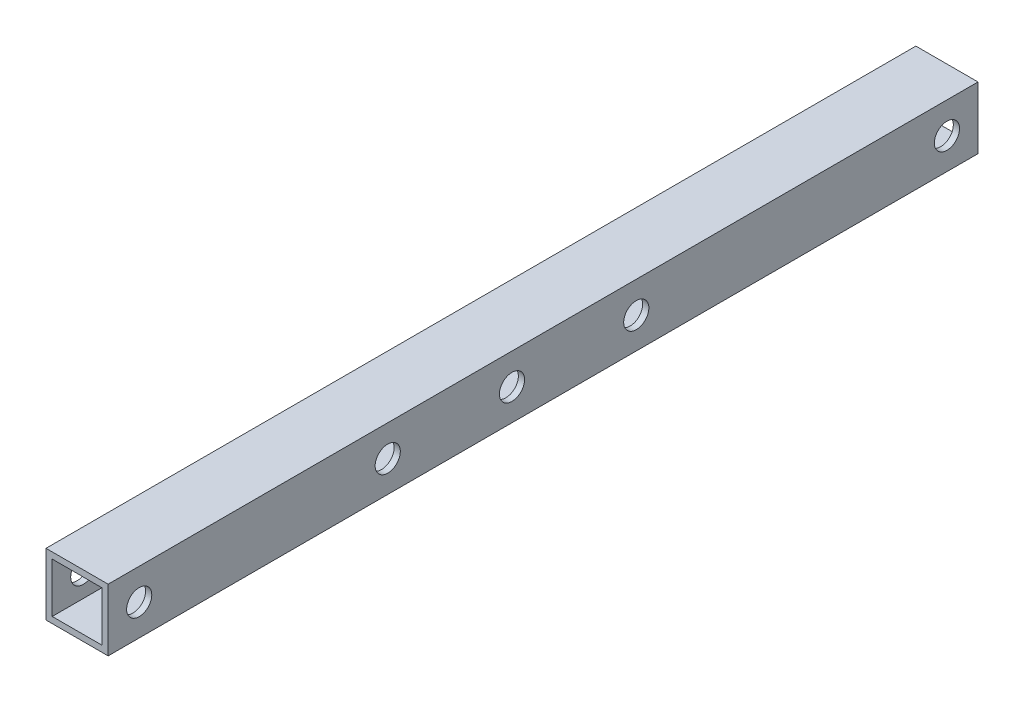
ISO-10303-21;
HEADER;
FILE_DESCRIPTION(('STEP AP214'),'2;1');
FILE_NAME('part.step','',(''),(''),'','','');
FILE_SCHEMA(('AUTOMOTIVE_DESIGN { 1 0 10303 214 1 1 1 1 }'));
ENDSEC;
DATA;
#1=APPLICATION_CONTEXT('core data for automotive mechanical design processes');
#2=APPLICATION_PROTOCOL_DEFINITION('international standard','automotive_design',2000,#1);
#3=PRODUCT_CONTEXT('',#1,'mechanical');
#4=PRODUCT('Part','Part','',(#3));
#5=PRODUCT_RELATED_PRODUCT_CATEGORY('part','',(#4));
#6=PRODUCT_DEFINITION_FORMATION('','',#4);
#7=PRODUCT_DEFINITION_CONTEXT('part definition',#1,'design');
#8=PRODUCT_DEFINITION('design','',#6,#7);
#9=PRODUCT_DEFINITION_SHAPE('','',#8);
#10=(LENGTH_UNIT() NAMED_UNIT(*) SI_UNIT(.MILLI.,.METRE.));
#11=(NAMED_UNIT(*) PLANE_ANGLE_UNIT() SI_UNIT($,.RADIAN.));
#12=(NAMED_UNIT(*) SI_UNIT($,.STERADIAN.) SOLID_ANGLE_UNIT());
#13=UNCERTAINTY_MEASURE_WITH_UNIT(LENGTH_MEASURE(1.E-05),#10,'distance_accuracy_value','');
#14=(GEOMETRIC_REPRESENTATION_CONTEXT(3) GLOBAL_UNCERTAINTY_ASSIGNED_CONTEXT((#13)) GLOBAL_UNIT_ASSIGNED_CONTEXT((#10,
#11,#12)) REPRESENTATION_CONTEXT('',''));
#15=CARTESIAN_POINT('',(0.,0.,0.));
#16=DIRECTION('',(0.,0.,1.));
#17=DIRECTION('',(1.,0.,0.));
#18=AXIS2_PLACEMENT_3D('',#15,#16,#17);
#19=CARTESIAN_POINT('',(0.,0.,140.));
#20=DIRECTION('',(0.,0.,1.));
#21=DIRECTION('',(1.,0.,0.));
#22=AXIS2_PLACEMENT_3D('',#19,#20,#21);
#23=PLANE('',#22);
#24=DIRECTION('',(0.,1.,0.));
#25=VECTOR('',#24,1.);
#26=CARTESIAN_POINT('',(4.99999999999999,5.,140.));
#27=LINE('',#26,#25);
#28=CARTESIAN_POINT('',(4.99999999999999,-5.00000000000001,140.));
#29=VERTEX_POINT('',#28);
#30=CARTESIAN_POINT('',(4.99999999999999,5.,140.));
#31=VERTEX_POINT('',#30);
#32=EDGE_CURVE('E157',#29,#31,#27,.T.);
#33=ORIENTED_EDGE('',*,*,#32,.T.);
#34=DIRECTION('',(-1.,0.,0.));
#35=VECTOR('',#34,1.);
#36=CARTESIAN_POINT('',(-5.00000000000001,5.,140.));
#37=LINE('',#36,#35);
#38=CARTESIAN_POINT('',(-5.00000000000001,5.,140.));
#39=VERTEX_POINT('',#38);
#40=EDGE_CURVE('E161',#31,#39,#37,.T.);
#41=ORIENTED_EDGE('',*,*,#40,.T.);
#42=DIRECTION('',(0.,-1.,0.));
#43=VECTOR('',#42,1.);
#44=CARTESIAN_POINT('',(-5.00000000000001,5.,140.));
#45=LINE('',#44,#43);
#46=CARTESIAN_POINT('',(-5.00000000000001,-5.00000000000001,140.));
#47=VERTEX_POINT('',#46);
#48=EDGE_CURVE('E165',#39,#47,#45,.T.);
#49=ORIENTED_EDGE('',*,*,#48,.T.);
#50=DIRECTION('',(1.,0.,0.));
#51=VECTOR('',#50,1.);
#52=CARTESIAN_POINT('',(-5.00000000000001,-5.00000000000001,140.));
#53=LINE('',#52,#51);
#54=EDGE_CURVE('E168',#47,#29,#53,.T.);
#55=ORIENTED_EDGE('',*,*,#54,.T.);
#56=EDGE_LOOP('',(#33,#41,#49,#55));
#57=FACE_BOUND('',#56,.T.);
#58=DIRECTION('',(-1.,0.,0.));
#59=VECTOR('',#58,1.);
#60=CARTESIAN_POINT('',(-4.00000000000001,4.,140.));
#61=LINE('',#60,#59);
#62=CARTESIAN_POINT('',(3.99999999999999,4.,140.));
#63=VERTEX_POINT('',#62);
#64=CARTESIAN_POINT('',(-4.00000000000001,4.,140.));
#65=VERTEX_POINT('',#64);
#66=EDGE_CURVE('E116',#63,#65,#61,.T.);
#67=ORIENTED_EDGE('',*,*,#66,.F.);
#68=DIRECTION('',(0.,1.,0.));
#69=VECTOR('',#68,1.);
#70=CARTESIAN_POINT('',(3.99999999999999,4.,140.));
#71=LINE('',#70,#69);
#72=CARTESIAN_POINT('',(3.99999999999999,-4.,140.));
#73=VERTEX_POINT('',#72);
#74=EDGE_CURVE('E107',#73,#63,#71,.T.);
#75=ORIENTED_EDGE('',*,*,#74,.F.);
#76=DIRECTION('',(1.,0.,0.));
#77=VECTOR('',#76,1.);
#78=CARTESIAN_POINT('',(-4.00000000000001,-4.,140.));
#79=LINE('',#78,#77);
#80=CARTESIAN_POINT('',(-4.00000000000001,-4.,140.));
#81=VERTEX_POINT('',#80);
#82=EDGE_CURVE('E133',#81,#73,#79,.T.);
#83=ORIENTED_EDGE('',*,*,#82,.F.);
#84=DIRECTION('',(0.,-1.,0.));
#85=VECTOR('',#84,1.);
#86=CARTESIAN_POINT('',(-4.00000000000001,4.,140.));
#87=LINE('',#86,#85);
#88=EDGE_CURVE('E129',#65,#81,#87,.T.);
#89=ORIENTED_EDGE('',*,*,#88,.F.);
#90=EDGE_LOOP('',(#67,#75,#83,#89));
#91=FACE_BOUND('',#90,.T.);
#92=ADVANCED_FACE('F39',(#57,#91),#23,.T.);
#93=CARTESIAN_POINT('',(0.,0.,0.));
#94=DIRECTION('',(0.,0.,1.));
#95=DIRECTION('',(1.,0.,0.));
#96=AXIS2_PLACEMENT_3D('',#93,#94,#95);
#97=PLANE('',#96);
#98=DIRECTION('',(0.,1.,0.));
#99=VECTOR('',#98,1.);
#100=CARTESIAN_POINT('',(4.99999999999999,5.,0.));
#101=LINE('',#100,#99);
#102=CARTESIAN_POINT('',(4.99999999999999,-5.00000000000001,0.));
#103=VERTEX_POINT('',#102);
#104=CARTESIAN_POINT('',(4.99999999999999,5.,0.));
#105=VERTEX_POINT('',#104);
#106=EDGE_CURVE('E125',#103,#105,#101,.T.);
#107=ORIENTED_EDGE('',*,*,#106,.F.);
#108=DIRECTION('',(1.,0.,0.));
#109=VECTOR('',#108,1.);
#110=CARTESIAN_POINT('',(-5.00000000000001,-5.00000000000001,0.));
#111=LINE('',#110,#109);
#112=CARTESIAN_POINT('',(-5.00000000000001,-5.00000000000001,0.));
#113=VERTEX_POINT('',#112);
#114=EDGE_CURVE('E162',#113,#103,#111,.T.);
#115=ORIENTED_EDGE('',*,*,#114,.F.);
#116=DIRECTION('',(0.,-1.,0.));
#117=VECTOR('',#116,1.);
#118=CARTESIAN_POINT('',(-5.00000000000001,5.,0.));
#119=LINE('',#118,#117);
#120=CARTESIAN_POINT('',(-5.00000000000001,5.,0.));
#121=VERTEX_POINT('',#120);
#122=EDGE_CURVE('E178',#121,#113,#119,.T.);
#123=ORIENTED_EDGE('',*,*,#122,.F.);
#124=DIRECTION('',(-1.,0.,0.));
#125=VECTOR('',#124,1.);
#126=CARTESIAN_POINT('',(-5.00000000000001,5.,0.));
#127=LINE('',#126,#125);
#128=EDGE_CURVE('E175',#105,#121,#127,.T.);
#129=ORIENTED_EDGE('',*,*,#128,.F.);
#130=EDGE_LOOP('',(#107,#115,#123,#129));
#131=FACE_BOUND('',#130,.T.);
#132=DIRECTION('',(0.,1.,0.));
#133=VECTOR('',#132,1.);
#134=CARTESIAN_POINT('',(3.99999999999999,4.,0.));
#135=LINE('',#134,#133);
#136=CARTESIAN_POINT('',(3.99999999999999,-4.,0.));
#137=VERTEX_POINT('',#136);
#138=CARTESIAN_POINT('',(3.99999999999999,4.,0.));
#139=VERTEX_POINT('',#138);
#140=EDGE_CURVE('E65',#137,#139,#135,.T.);
#141=ORIENTED_EDGE('',*,*,#140,.T.);
#142=DIRECTION('',(-1.,0.,0.));
#143=VECTOR('',#142,1.);
#144=CARTESIAN_POINT('',(-4.00000000000001,4.,0.));
#145=LINE('',#144,#143);
#146=CARTESIAN_POINT('',(-4.00000000000001,4.,0.));
#147=VERTEX_POINT('',#146);
#148=EDGE_CURVE('E123',#139,#147,#145,.T.);
#149=ORIENTED_EDGE('',*,*,#148,.T.);
#150=DIRECTION('',(0.,-1.,0.));
#151=VECTOR('',#150,1.);
#152=CARTESIAN_POINT('',(-4.00000000000001,4.,0.));
#153=LINE('',#152,#151);
#154=CARTESIAN_POINT('',(-4.00000000000001,-4.,0.));
#155=VERTEX_POINT('',#154);
#156=EDGE_CURVE('E144',#147,#155,#153,.T.);
#157=ORIENTED_EDGE('',*,*,#156,.T.);
#158=DIRECTION('',(1.,0.,0.));
#159=VECTOR('',#158,1.);
#160=CARTESIAN_POINT('',(-4.00000000000001,-4.,0.));
#161=LINE('',#160,#159);
#162=EDGE_CURVE('E117',#155,#137,#161,.T.);
#163=ORIENTED_EDGE('',*,*,#162,.T.);
#164=EDGE_LOOP('',(#141,#149,#157,#163));
#165=FACE_BOUND('',#164,.T.);
#166=ADVANCED_FACE('F291',(#131,#165),#97,.F.);
#167=CARTESIAN_POINT('',(4.99999999999999,5.,140.));
#168=DIRECTION('',(-1.,0.,0.));
#169=DIRECTION('',(0.,-1.,0.));
#170=AXIS2_PLACEMENT_3D('',#167,#168,#169);
#171=PLANE('',#170);
#172=CARTESIAN_POINT('',(4.99999999999999,0.,135.));
#173=DIRECTION('',(1.,0.,0.));
#174=DIRECTION('',(0.,1.,0.));
#175=AXIS2_PLACEMENT_3D('',#172,#173,#174);
#176=CIRCLE('',#175,2.02500000000001);
#177=CARTESIAN_POINT('',(4.99999999999999,2.02500000000001,135.));
#178=VERTEX_POINT('',#177);
#179=EDGE_CURVE('E220',#178,#178,#176,.T.);
#180=ORIENTED_EDGE('',*,*,#179,.F.);
#181=EDGE_LOOP('',(#180));
#182=FACE_BOUND('',#181,.T.);
#183=CARTESIAN_POINT('',(4.99999999999999,0.,95.));
#184=DIRECTION('',(1.,0.,0.));
#185=DIRECTION('',(0.,1.,0.));
#186=AXIS2_PLACEMENT_3D('',#183,#184,#185);
#187=CIRCLE('',#186,2.02499999999999);
#188=CARTESIAN_POINT('',(4.99999999999999,2.025,95.));
#189=VERTEX_POINT('',#188);
#190=EDGE_CURVE('E232',#189,#189,#187,.T.);
#191=ORIENTED_EDGE('',*,*,#190,.F.);
#192=EDGE_LOOP('',(#191));
#193=FACE_BOUND('',#192,.T.);
#194=CARTESIAN_POINT('',(4.99999999999999,0.,75.));
#195=DIRECTION('',(1.,0.,0.));
#196=DIRECTION('',(0.,1.,0.));
#197=AXIS2_PLACEMENT_3D('',#194,#195,#196);
#198=CIRCLE('',#197,2.02499999999999);
#199=CARTESIAN_POINT('',(4.99999999999999,2.025,75.));
#200=VERTEX_POINT('',#199);
#201=EDGE_CURVE('E244',#200,#200,#198,.T.);
#202=ORIENTED_EDGE('',*,*,#201,.F.);
#203=EDGE_LOOP('',(#202));
#204=FACE_BOUND('',#203,.T.);
#205=CARTESIAN_POINT('',(4.99999999999999,0.,55.));
#206=DIRECTION('',(1.,0.,0.));
#207=DIRECTION('',(0.,1.,0.));
#208=AXIS2_PLACEMENT_3D('',#205,#206,#207);
#209=CIRCLE('',#208,2.025);
#210=CARTESIAN_POINT('',(4.99999999999999,2.025,55.));
#211=VERTEX_POINT('',#210);
#212=EDGE_CURVE('E240',#211,#211,#209,.T.);
#213=ORIENTED_EDGE('',*,*,#212,.F.);
#214=EDGE_LOOP('',(#213));
#215=FACE_BOUND('',#214,.T.);
#216=CARTESIAN_POINT('',(4.99999999999999,0.,5.));
#217=DIRECTION('',(1.,0.,0.));
#218=DIRECTION('',(0.,1.,0.));
#219=AXIS2_PLACEMENT_3D('',#216,#217,#218);
#220=CIRCLE('',#219,2.025);
#221=CARTESIAN_POINT('',(4.99999999999999,2.025,5.));
#222=VERTEX_POINT('',#221);
#223=EDGE_CURVE('E261',#222,#222,#220,.T.);
#224=ORIENTED_EDGE('',*,*,#223,.F.);
#225=EDGE_LOOP('',(#224));
#226=FACE_BOUND('',#225,.T.);
#227=ORIENTED_EDGE('',*,*,#106,.T.);
#228=DIRECTION('',(0.,0.,-1.));
#229=VECTOR('',#228,1.);
#230=CARTESIAN_POINT('',(4.99999999999999,5.,140.));
#231=LINE('',#230,#229);
#232=EDGE_CURVE('E11',#31,#105,#231,.T.);
#233=ORIENTED_EDGE('',*,*,#232,.F.);
#234=ORIENTED_EDGE('',*,*,#32,.F.);
#235=DIRECTION('',(0.,0.,-1.));
#236=VECTOR('',#235,1.);
#237=CARTESIAN_POINT('',(4.99999999999999,-5.00000000000001,140.));
#238=LINE('',#237,#236);
#239=EDGE_CURVE('E171',#29,#103,#238,.T.);
#240=ORIENTED_EDGE('',*,*,#239,.T.);
#241=EDGE_LOOP('',(#227,#233,#234,#240));
#242=FACE_BOUND('',#241,.T.);
#243=ADVANCED_FACE('F41',(#182,#193,#204,#215,#226,#242),#171,.F.);
#244=CARTESIAN_POINT('',(-5.00000000000001,5.,140.));
#245=DIRECTION('',(0.,-1.,0.));
#246=DIRECTION('',(0.,0.,-1.));
#247=AXIS2_PLACEMENT_3D('',#244,#245,#246);
#248=PLANE('',#247);
#249=ORIENTED_EDGE('',*,*,#128,.T.);
#250=DIRECTION('',(0.,0.,-1.));
#251=VECTOR('',#250,1.);
#252=CARTESIAN_POINT('',(-5.00000000000001,5.,140.));
#253=LINE('',#252,#251);
#254=EDGE_CURVE('E49',#39,#121,#253,.T.);
#255=ORIENTED_EDGE('',*,*,#254,.F.);
#256=ORIENTED_EDGE('',*,*,#40,.F.);
#257=ORIENTED_EDGE('',*,*,#232,.T.);
#258=EDGE_LOOP('',(#249,#255,#256,#257));
#259=FACE_BOUND('',#258,.T.);
#260=ADVANCED_FACE('F300',(#259),#248,.F.);
#261=CARTESIAN_POINT('',(-5.00000000000001,5.,140.));
#262=DIRECTION('',(1.,0.,0.));
#263=DIRECTION('',(0.,1.,0.));
#264=AXIS2_PLACEMENT_3D('',#261,#262,#263);
#265=PLANE('',#264);
#266=CARTESIAN_POINT('',(-5.00000000000002,0.,135.));
#267=DIRECTION('',(1.,0.,0.));
#268=DIRECTION('',(0.,1.,0.));
#269=AXIS2_PLACEMENT_3D('',#266,#267,#268);
#270=CIRCLE('',#269,2.02500000000001);
#271=CARTESIAN_POINT('',(-5.00000000000002,2.02500000000001,135.));
#272=VERTEX_POINT('',#271);
#273=EDGE_CURVE('E212',#272,#272,#270,.T.);
#274=ORIENTED_EDGE('',*,*,#273,.T.);
#275=EDGE_LOOP('',(#274));
#276=FACE_BOUND('',#275,.T.);
#277=CARTESIAN_POINT('',(-5.00000000000002,0.,95.));
#278=DIRECTION('',(1.,0.,0.));
#279=DIRECTION('',(0.,1.,0.));
#280=AXIS2_PLACEMENT_3D('',#277,#278,#279);
#281=CIRCLE('',#280,2.02499999999999);
#282=CARTESIAN_POINT('',(-5.00000000000002,2.02499999999999,95.));
#283=VERTEX_POINT('',#282);
#284=EDGE_CURVE('E226',#283,#283,#281,.T.);
#285=ORIENTED_EDGE('',*,*,#284,.T.);
#286=EDGE_LOOP('',(#285));
#287=FACE_BOUND('',#286,.T.);
#288=CARTESIAN_POINT('',(-5.00000000000001,0.,75.));
#289=DIRECTION('',(1.,0.,0.));
#290=DIRECTION('',(0.,1.,0.));
#291=AXIS2_PLACEMENT_3D('',#288,#289,#290);
#292=CIRCLE('',#291,2.02499999999999);
#293=CARTESIAN_POINT('',(-5.00000000000001,2.02499999999999,75.));
#294=VERTEX_POINT('',#293);
#295=EDGE_CURVE('E203',#294,#294,#292,.T.);
#296=ORIENTED_EDGE('',*,*,#295,.T.);
#297=EDGE_LOOP('',(#296));
#298=FACE_BOUND('',#297,.T.);
#299=CARTESIAN_POINT('',(-5.00000000000001,0.,55.));
#300=DIRECTION('',(1.,0.,0.));
#301=DIRECTION('',(0.,1.,0.));
#302=AXIS2_PLACEMENT_3D('',#299,#300,#301);
#303=CIRCLE('',#302,2.025);
#304=CARTESIAN_POINT('',(-5.00000000000001,2.025,55.));
#305=VERTEX_POINT('',#304);
#306=EDGE_CURVE('E248',#305,#305,#303,.T.);
#307=ORIENTED_EDGE('',*,*,#306,.T.);
#308=EDGE_LOOP('',(#307));
#309=FACE_BOUND('',#308,.T.);
#310=CARTESIAN_POINT('',(-5.00000000000001,0.,5.));
#311=DIRECTION('',(1.,0.,0.));
#312=DIRECTION('',(0.,1.,0.));
#313=AXIS2_PLACEMENT_3D('',#310,#311,#312);
#314=CIRCLE('',#313,2.025);
#315=CARTESIAN_POINT('',(-5.00000000000001,2.025,5.));
#316=VERTEX_POINT('',#315);
#317=EDGE_CURVE('E197',#316,#316,#314,.T.);
#318=ORIENTED_EDGE('',*,*,#317,.T.);
#319=EDGE_LOOP('',(#318));
#320=FACE_BOUND('',#319,.T.);
#321=ORIENTED_EDGE('',*,*,#122,.T.);
#322=DIRECTION('',(0.,0.,-1.));
#323=VECTOR('',#322,1.);
#324=CARTESIAN_POINT('',(-5.00000000000001,-5.00000000000001,140.));
#325=LINE('',#324,#323);
#326=EDGE_CURVE('E186',#47,#113,#325,.T.);
#327=ORIENTED_EDGE('',*,*,#326,.F.);
#328=ORIENTED_EDGE('',*,*,#48,.F.);
#329=ORIENTED_EDGE('',*,*,#254,.T.);
#330=EDGE_LOOP('',(#321,#327,#328,#329));
#331=FACE_BOUND('',#330,.T.);
#332=ADVANCED_FACE('F284',(#276,#287,#298,#309,#320,#331),#265,.F.);
#333=CARTESIAN_POINT('',(-5.00000000000001,-5.00000000000001,140.));
#334=DIRECTION('',(0.,1.,0.));
#335=DIRECTION('',(0.,0.,1.));
#336=AXIS2_PLACEMENT_3D('',#333,#334,#335);
#337=PLANE('',#336);
#338=ORIENTED_EDGE('',*,*,#114,.T.);
#339=ORIENTED_EDGE('',*,*,#239,.F.);
#340=ORIENTED_EDGE('',*,*,#54,.F.);
#341=ORIENTED_EDGE('',*,*,#326,.T.);
#342=EDGE_LOOP('',(#338,#339,#340,#341));
#343=FACE_BOUND('',#342,.T.);
#344=ADVANCED_FACE('F275',(#343),#337,.F.);
#345=CARTESIAN_POINT('',(3.99999999999999,4.,140.));
#346=DIRECTION('',(-1.,0.,0.));
#347=DIRECTION('',(0.,0.,1.));
#348=AXIS2_PLACEMENT_3D('',#345,#346,#347);
#349=PLANE('',#348);
#350=CARTESIAN_POINT('',(3.99999999999999,0.,135.));
#351=DIRECTION('',(-1.,0.,0.));
#352=DIRECTION('',(0.,0.,1.));
#353=AXIS2_PLACEMENT_3D('',#350,#351,#352);
#354=CIRCLE('',#353,2.02500000000001);
#355=CARTESIAN_POINT('',(3.99999999999999,0.,137.025));
#356=VERTEX_POINT('',#355);
#357=EDGE_CURVE('E236',#356,#356,#354,.T.);
#358=ORIENTED_EDGE('',*,*,#357,.F.);
#359=EDGE_LOOP('',(#358));
#360=FACE_BOUND('',#359,.T.);
#361=CARTESIAN_POINT('',(3.99999999999999,0.,95.));
#362=DIRECTION('',(-1.,0.,0.));
#363=DIRECTION('',(0.,0.,1.));
#364=AXIS2_PLACEMENT_3D('',#361,#362,#363);
#365=CIRCLE('',#364,2.02499999999999);
#366=CARTESIAN_POINT('',(3.99999999999999,0.,97.025));
#367=VERTEX_POINT('',#366);
#368=EDGE_CURVE('E211',#367,#367,#365,.T.);
#369=ORIENTED_EDGE('',*,*,#368,.F.);
#370=EDGE_LOOP('',(#369));
#371=FACE_BOUND('',#370,.T.);
#372=CARTESIAN_POINT('',(3.99999999999999,0.,75.));
#373=DIRECTION('',(-1.,0.,0.));
#374=DIRECTION('',(0.,0.,1.));
#375=AXIS2_PLACEMENT_3D('',#372,#373,#374);
#376=CIRCLE('',#375,2.02499999999999);
#377=CARTESIAN_POINT('',(3.99999999999999,0.,77.025));
#378=VERTEX_POINT('',#377);
#379=EDGE_CURVE('E207',#378,#378,#376,.T.);
#380=ORIENTED_EDGE('',*,*,#379,.F.);
#381=EDGE_LOOP('',(#380));
#382=FACE_BOUND('',#381,.T.);
#383=CARTESIAN_POINT('',(3.99999999999999,0.,55.));
#384=DIRECTION('',(-1.,0.,0.));
#385=DIRECTION('',(0.,0.,1.));
#386=AXIS2_PLACEMENT_3D('',#383,#384,#385);
#387=CIRCLE('',#386,2.025);
#388=CARTESIAN_POINT('',(3.99999999999999,0.,57.025));
#389=VERTEX_POINT('',#388);
#390=EDGE_CURVE('E202',#389,#389,#387,.T.);
#391=ORIENTED_EDGE('',*,*,#390,.F.);
#392=EDGE_LOOP('',(#391));
#393=FACE_BOUND('',#392,.T.);
#394=CARTESIAN_POINT('',(3.99999999999999,0.,5.));
#395=DIRECTION('',(-1.,0.,0.));
#396=DIRECTION('',(0.,0.,1.));
#397=AXIS2_PLACEMENT_3D('',#394,#395,#396);
#398=CIRCLE('',#397,2.025);
#399=CARTESIAN_POINT('',(3.99999999999999,2.025,5.));
#400=VERTEX_POINT('',#399);
#401=EDGE_CURVE('E141',#400,#400,#398,.T.);
#402=ORIENTED_EDGE('',*,*,#401,.F.);
#403=EDGE_LOOP('',(#402));
#404=FACE_BOUND('',#403,.T.);
#405=ORIENTED_EDGE('',*,*,#140,.F.);
#406=DIRECTION('',(0.,0.,-1.));
#407=VECTOR('',#406,1.);
#408=CARTESIAN_POINT('',(3.99999999999999,-4.,140.));
#409=LINE('',#408,#407);
#410=EDGE_CURVE('E111',#73,#137,#409,.T.);
#411=ORIENTED_EDGE('',*,*,#410,.F.);
#412=ORIENTED_EDGE('',*,*,#74,.T.);
#413=DIRECTION('',(0.,0.,-1.));
#414=VECTOR('',#413,1.);
#415=CARTESIAN_POINT('',(3.99999999999999,4.,140.));
#416=LINE('',#415,#414);
#417=EDGE_CURVE('E110',#63,#139,#416,.T.);
#418=ORIENTED_EDGE('',*,*,#417,.T.);
#419=EDGE_LOOP('',(#405,#411,#412,#418));
#420=FACE_BOUND('',#419,.T.);
#421=ADVANCED_FACE('F109',(#360,#371,#382,#393,#404,#420),#349,.T.);
#422=CARTESIAN_POINT('',(-4.00000000000001,4.,140.));
#423=DIRECTION('',(0.,-1.,0.));
#424=DIRECTION('',(0.,0.,-1.));
#425=AXIS2_PLACEMENT_3D('',#422,#423,#424);
#426=PLANE('',#425);
#427=ORIENTED_EDGE('',*,*,#148,.F.);
#428=ORIENTED_EDGE('',*,*,#417,.F.);
#429=ORIENTED_EDGE('',*,*,#66,.T.);
#430=DIRECTION('',(0.,0.,-1.));
#431=VECTOR('',#430,1.);
#432=CARTESIAN_POINT('',(-4.00000000000001,4.,140.));
#433=LINE('',#432,#431);
#434=EDGE_CURVE('E126',#65,#147,#433,.T.);
#435=ORIENTED_EDGE('',*,*,#434,.T.);
#436=EDGE_LOOP('',(#427,#428,#429,#435));
#437=FACE_BOUND('',#436,.T.);
#438=ADVANCED_FACE('F120',(#437),#426,.T.);
#439=CARTESIAN_POINT('',(-4.00000000000001,4.,140.));
#440=DIRECTION('',(1.,0.,0.));
#441=DIRECTION('',(0.,1.,0.));
#442=AXIS2_PLACEMENT_3D('',#439,#440,#441);
#443=PLANE('',#442);
#444=CARTESIAN_POINT('',(-4.00000000000001,0.,135.));
#445=DIRECTION('',(1.,0.,0.));
#446=DIRECTION('',(0.,1.,0.));
#447=AXIS2_PLACEMENT_3D('',#444,#445,#446);
#448=CIRCLE('',#447,2.02500000000001);
#449=CARTESIAN_POINT('',(-4.00000000000001,2.02500000000001,135.));
#450=VERTEX_POINT('',#449);
#451=EDGE_CURVE('E43',#450,#450,#448,.T.);
#452=ORIENTED_EDGE('',*,*,#451,.F.);
#453=EDGE_LOOP('',(#452));
#454=FACE_BOUND('',#453,.T.);
#455=CARTESIAN_POINT('',(-4.00000000000001,0.,95.));
#456=DIRECTION('',(1.,0.,0.));
#457=DIRECTION('',(0.,1.,0.));
#458=AXIS2_PLACEMENT_3D('',#455,#456,#457);
#459=CIRCLE('',#458,2.02499999999999);
#460=CARTESIAN_POINT('',(-4.00000000000001,2.02499999999999,95.));
#461=VERTEX_POINT('',#460);
#462=EDGE_CURVE('E208',#461,#461,#459,.T.);
#463=ORIENTED_EDGE('',*,*,#462,.F.);
#464=EDGE_LOOP('',(#463));
#465=FACE_BOUND('',#464,.T.);
#466=CARTESIAN_POINT('',(-4.00000000000001,0.,75.));
#467=DIRECTION('',(1.,0.,0.));
#468=DIRECTION('',(0.,1.,0.));
#469=AXIS2_PLACEMENT_3D('',#466,#467,#468);
#470=CIRCLE('',#469,2.02499999999999);
#471=CARTESIAN_POINT('',(-4.00000000000001,2.02499999999999,75.));
#472=VERTEX_POINT('',#471);
#473=EDGE_CURVE('E204',#472,#472,#470,.T.);
#474=ORIENTED_EDGE('',*,*,#473,.F.);
#475=EDGE_LOOP('',(#474));
#476=FACE_BOUND('',#475,.T.);
#477=CARTESIAN_POINT('',(-4.00000000000001,0.,55.));
#478=DIRECTION('',(1.,0.,0.));
#479=DIRECTION('',(0.,1.,0.));
#480=AXIS2_PLACEMENT_3D('',#477,#478,#479);
#481=CIRCLE('',#480,2.025);
#482=CARTESIAN_POINT('',(-4.00000000000001,2.025,55.));
#483=VERTEX_POINT('',#482);
#484=EDGE_CURVE('E198',#483,#483,#481,.T.);
#485=ORIENTED_EDGE('',*,*,#484,.F.);
#486=EDGE_LOOP('',(#485));
#487=FACE_BOUND('',#486,.T.);
#488=CARTESIAN_POINT('',(-4.00000000000001,0.,5.));
#489=DIRECTION('',(1.,0.,0.));
#490=DIRECTION('',(0.,1.,0.));
#491=AXIS2_PLACEMENT_3D('',#488,#489,#490);
#492=CIRCLE('',#491,2.025);
#493=CARTESIAN_POINT('',(-4.00000000000001,2.025,5.));
#494=VERTEX_POINT('',#493);
#495=EDGE_CURVE('E193',#494,#494,#492,.T.);
#496=ORIENTED_EDGE('',*,*,#495,.F.);
#497=EDGE_LOOP('',(#496));
#498=FACE_BOUND('',#497,.T.);
#499=ORIENTED_EDGE('',*,*,#156,.F.);
#500=ORIENTED_EDGE('',*,*,#434,.F.);
#501=ORIENTED_EDGE('',*,*,#88,.T.);
#502=DIRECTION('',(0.,0.,-1.));
#503=VECTOR('',#502,1.);
#504=CARTESIAN_POINT('',(-4.00000000000001,-4.,140.));
#505=LINE('',#504,#503);
#506=EDGE_CURVE('E57',#81,#155,#505,.T.);
#507=ORIENTED_EDGE('',*,*,#506,.T.);
#508=EDGE_LOOP('',(#499,#500,#501,#507));
#509=FACE_BOUND('',#508,.T.);
#510=ADVANCED_FACE('F282',(#454,#465,#476,#487,#498,#509),#443,.T.);
#511=CARTESIAN_POINT('',(-4.00000000000001,-4.,140.));
#512=DIRECTION('',(0.,1.,0.));
#513=DIRECTION('',(0.,0.,1.));
#514=AXIS2_PLACEMENT_3D('',#511,#512,#513);
#515=PLANE('',#514);
#516=ORIENTED_EDGE('',*,*,#162,.F.);
#517=ORIENTED_EDGE('',*,*,#506,.F.);
#518=ORIENTED_EDGE('',*,*,#82,.T.);
#519=ORIENTED_EDGE('',*,*,#410,.T.);
#520=EDGE_LOOP('',(#516,#517,#518,#519));
#521=FACE_BOUND('',#520,.T.);
#522=ADVANCED_FACE('F321',(#521),#515,.T.);
#523=CARTESIAN_POINT('',(-5.00000000000001,0.,5.));
#524=DIRECTION('',(1.,0.,0.));
#525=DIRECTION('',(0.,1.,0.));
#526=AXIS2_PLACEMENT_3D('',#523,#524,#525);
#527=CYLINDRICAL_SURFACE('',#526,2.025);
#528=CARTESIAN_POINT('',(-4.00000000000001,2.025,5.));
#529=CARTESIAN_POINT('',(-4.01041666666668,2.025,5.));
#530=CARTESIAN_POINT('',(-4.02083333333334,2.025,5.));
#531=CARTESIAN_POINT('',(-4.04166666666668,2.025,5.));
#532=CARTESIAN_POINT('',(-4.05208333333334,2.025,5.));
#533=CARTESIAN_POINT('',(-4.07291666666668,2.025,5.));
#534=CARTESIAN_POINT('',(-4.08333333333334,2.025,5.));
#535=CARTESIAN_POINT('',(-4.10416666666668,2.025,5.));
#536=CARTESIAN_POINT('',(-4.11458333333334,2.025,5.));
#537=CARTESIAN_POINT('',(-4.13541666666668,2.025,5.));
#538=CARTESIAN_POINT('',(-4.14583333333334,2.025,5.));
#539=CARTESIAN_POINT('',(-4.16666666666668,2.025,5.));
#540=CARTESIAN_POINT('',(-4.17708333333334,2.025,5.));
#541=CARTESIAN_POINT('',(-4.19791666666668,2.025,5.));
#542=CARTESIAN_POINT('',(-4.20833333333334,2.025,5.));
#543=CARTESIAN_POINT('',(-4.22916666666668,2.025,5.));
#544=CARTESIAN_POINT('',(-4.23958333333334,2.025,5.));
#545=CARTESIAN_POINT('',(-4.26041666666668,2.025,5.));
#546=CARTESIAN_POINT('',(-4.27083333333334,2.025,5.));
#547=CARTESIAN_POINT('',(-4.29166666666668,2.025,5.));
#548=CARTESIAN_POINT('',(-4.30208333333334,2.025,5.));
#549=CARTESIAN_POINT('',(-4.32291666666668,2.025,5.));
#550=CARTESIAN_POINT('',(-4.33333333333334,2.025,5.));
#551=CARTESIAN_POINT('',(-4.35416666666668,2.025,5.));
#552=CARTESIAN_POINT('',(-4.36458333333334,2.025,5.));
#553=CARTESIAN_POINT('',(-4.38541666666668,2.025,5.));
#554=CARTESIAN_POINT('',(-4.39583333333334,2.025,5.));
#555=CARTESIAN_POINT('',(-4.41666666666668,2.025,5.));
#556=CARTESIAN_POINT('',(-4.42708333333334,2.025,5.));
#557=CARTESIAN_POINT('',(-4.44791666666668,2.025,5.));
#558=CARTESIAN_POINT('',(-4.45833333333334,2.025,5.));
#559=CARTESIAN_POINT('',(-4.47916666666668,2.025,5.));
#560=CARTESIAN_POINT('',(-4.48958333333334,2.025,5.));
#561=CARTESIAN_POINT('',(-4.51041666666668,2.025,5.));
#562=CARTESIAN_POINT('',(-4.52083333333334,2.025,5.));
#563=CARTESIAN_POINT('',(-4.54166666666668,2.025,5.));
#564=CARTESIAN_POINT('',(-4.55208333333334,2.025,5.));
#565=CARTESIAN_POINT('',(-4.57291666666668,2.025,5.));
#566=CARTESIAN_POINT('',(-4.58333333333334,2.025,5.));
#567=CARTESIAN_POINT('',(-4.60416666666668,2.025,5.));
#568=CARTESIAN_POINT('',(-4.61458333333334,2.025,5.));
#569=CARTESIAN_POINT('',(-4.63541666666668,2.025,5.));
#570=CARTESIAN_POINT('',(-4.64583333333334,2.025,5.));
#571=CARTESIAN_POINT('',(-4.66666666666668,2.025,5.));
#572=CARTESIAN_POINT('',(-4.67708333333335,2.025,5.));
#573=CARTESIAN_POINT('',(-4.69791666666668,2.025,5.));
#574=CARTESIAN_POINT('',(-4.70833333333335,2.025,5.));
#575=CARTESIAN_POINT('',(-4.72916666666668,2.025,5.));
#576=CARTESIAN_POINT('',(-4.73958333333335,2.025,5.));
#577=CARTESIAN_POINT('',(-4.76041666666668,2.025,5.));
#578=CARTESIAN_POINT('',(-4.77083333333335,2.025,5.));
#579=CARTESIAN_POINT('',(-4.79166666666668,2.025,5.));
#580=CARTESIAN_POINT('',(-4.80208333333335,2.025,5.));
#581=CARTESIAN_POINT('',(-4.82291666666668,2.025,5.));
#582=CARTESIAN_POINT('',(-4.83333333333335,2.025,5.));
#583=CARTESIAN_POINT('',(-4.85416666666668,2.025,5.));
#584=CARTESIAN_POINT('',(-4.86458333333335,2.025,5.));
#585=CARTESIAN_POINT('',(-4.88541666666668,2.025,5.));
#586=CARTESIAN_POINT('',(-4.89583333333335,2.025,5.));
#587=CARTESIAN_POINT('',(-4.91666666666668,2.025,5.));
#588=CARTESIAN_POINT('',(-4.92708333333335,2.025,5.));
#589=CARTESIAN_POINT('',(-4.94791666666668,2.025,5.));
#590=CARTESIAN_POINT('',(-4.95833333333335,2.025,5.));
#591=CARTESIAN_POINT('',(-4.97916666666668,2.025,5.));
#592=CARTESIAN_POINT('',(-4.98958333333335,2.025,5.));
#593=CARTESIAN_POINT('',(-5.00000000000001,2.025,5.));
#594=B_SPLINE_CURVE_WITH_KNOTS('',3,(#528,#529,#530,#531,#532,#533,#534,#535,#536,#537,#538,
#539,#540,#541,#542,#543,#544,#545,#546,#547,#548,#549,#550,#551,#552,#553,#554,#555,#556,#557,
#558,#559,#560,#561,#562,#563,#564,#565,#566,#567,#568,#569,#570,#571,#572,#573,#574,#575,#576,
#577,#578,#579,#580,#581,#582,#583,#584,#585,#586,#587,#588,#589,#590,#591,#592,#593),
.UNSPECIFIED.,.F.,.F.,(4,2,2,2,2,2,2,2,2,2,2,2,2,2,2,2,2,2,2,2,2,2,2,2,2,2,2,2,2,2,2,2,4),(0.,
0.03125,0.0625000000000001,0.0937500000000001,0.125,0.15625,0.1875,0.21875,0.25,
0.281250000000001,0.312500000000001,0.343750000000001,0.375000000000001,0.406250000000001,
0.437500000000001,0.468750000000001,0.500000000000001,0.531250000000001,0.562500000000001,
0.593750000000001,0.625000000000001,0.656250000000002,0.687500000000002,0.718750000000002,
0.750000000000002,0.781250000000002,0.812500000000002,0.843750000000002,0.875000000000003,
0.906250000000003,0.937500000000003,0.968750000000003,1.),.UNSPECIFIED.);
#595=EDGE_CURVE('BSEAM323',#494,#316,#594,.T.);
#596=ORIENTED_EDGE('',*,*,#495,.T.);
#597=ORIENTED_EDGE('',*,*,#317,.F.);
#598=ORIENTED_EDGE('',*,*,#595,.T.);
#599=ORIENTED_EDGE('',*,*,#595,.F.);
#600=EDGE_LOOP('',(#596,#598,#597,#599));
#601=FACE_BOUND('',#600,.T.);
#602=ADVANCED_FACE('F323',(#601),#527,.F.);
#603=CARTESIAN_POINT('',(3.99999999999999,2.025,5.));
#604=CARTESIAN_POINT('',(4.01041666666666,2.025,5.));
#605=CARTESIAN_POINT('',(4.02083333333332,2.025,5.));
#606=CARTESIAN_POINT('',(4.04166666666666,2.025,5.));
#607=CARTESIAN_POINT('',(4.05208333333332,2.025,5.));
#608=CARTESIAN_POINT('',(4.07291666666666,2.025,5.));
#609=CARTESIAN_POINT('',(4.08333333333332,2.025,5.));
#610=CARTESIAN_POINT('',(4.10416666666666,2.025,5.));
#611=CARTESIAN_POINT('',(4.11458333333332,2.025,5.));
#612=CARTESIAN_POINT('',(4.13541666666666,2.025,5.));
#613=CARTESIAN_POINT('',(4.14583333333332,2.025,5.));
#614=CARTESIAN_POINT('',(4.16666666666666,2.025,5.));
#615=CARTESIAN_POINT('',(4.17708333333332,2.025,5.));
#616=CARTESIAN_POINT('',(4.19791666666666,2.025,5.));
#617=CARTESIAN_POINT('',(4.20833333333332,2.025,5.));
#618=CARTESIAN_POINT('',(4.22916666666666,2.025,5.));
#619=CARTESIAN_POINT('',(4.23958333333332,2.025,5.));
#620=CARTESIAN_POINT('',(4.26041666666666,2.025,5.));
#621=CARTESIAN_POINT('',(4.27083333333332,2.025,5.));
#622=CARTESIAN_POINT('',(4.29166666666666,2.025,5.));
#623=CARTESIAN_POINT('',(4.30208333333332,2.025,5.));
#624=CARTESIAN_POINT('',(4.32291666666666,2.025,5.));
#625=CARTESIAN_POINT('',(4.33333333333332,2.025,5.));
#626=CARTESIAN_POINT('',(4.35416666666666,2.025,5.));
#627=CARTESIAN_POINT('',(4.36458333333332,2.025,5.));
#628=CARTESIAN_POINT('',(4.38541666666666,2.025,5.));
#629=CARTESIAN_POINT('',(4.39583333333332,2.025,5.));
#630=CARTESIAN_POINT('',(4.41666666666666,2.025,5.));
#631=CARTESIAN_POINT('',(4.42708333333332,2.025,5.));
#632=CARTESIAN_POINT('',(4.44791666666666,2.025,5.));
#633=CARTESIAN_POINT('',(4.45833333333332,2.025,5.));
#634=CARTESIAN_POINT('',(4.47916666666666,2.025,5.));
#635=CARTESIAN_POINT('',(4.48958333333333,2.025,5.));
#636=CARTESIAN_POINT('',(4.51041666666666,2.025,5.));
#637=CARTESIAN_POINT('',(4.52083333333333,2.025,5.));
#638=CARTESIAN_POINT('',(4.54166666666666,2.025,5.));
#639=CARTESIAN_POINT('',(4.55208333333333,2.025,5.));
#640=CARTESIAN_POINT('',(4.57291666666666,2.025,5.));
#641=CARTESIAN_POINT('',(4.58333333333333,2.025,5.));
#642=CARTESIAN_POINT('',(4.60416666666666,2.025,5.));
#643=CARTESIAN_POINT('',(4.61458333333333,2.025,5.));
#644=CARTESIAN_POINT('',(4.63541666666666,2.025,5.));
#645=CARTESIAN_POINT('',(4.64583333333333,2.025,5.));
#646=CARTESIAN_POINT('',(4.66666666666666,2.025,5.));
#647=CARTESIAN_POINT('',(4.67708333333333,2.025,5.));
#648=CARTESIAN_POINT('',(4.69791666666666,2.025,5.));
#649=CARTESIAN_POINT('',(4.70833333333333,2.025,5.));
#650=CARTESIAN_POINT('',(4.72916666666666,2.025,5.));
#651=CARTESIAN_POINT('',(4.73958333333333,2.025,5.));
#652=CARTESIAN_POINT('',(4.76041666666666,2.025,5.));
#653=CARTESIAN_POINT('',(4.77083333333333,2.025,5.));
#654=CARTESIAN_POINT('',(4.79166666666666,2.025,5.));
#655=CARTESIAN_POINT('',(4.80208333333333,2.025,5.));
#656=CARTESIAN_POINT('',(4.82291666666666,2.025,5.));
#657=CARTESIAN_POINT('',(4.83333333333333,2.025,5.));
#658=CARTESIAN_POINT('',(4.85416666666666,2.025,5.));
#659=CARTESIAN_POINT('',(4.86458333333333,2.025,5.));
#660=CARTESIAN_POINT('',(4.88541666666666,2.025,5.));
#661=CARTESIAN_POINT('',(4.89583333333333,2.025,5.));
#662=CARTESIAN_POINT('',(4.91666666666666,2.025,5.));
#663=CARTESIAN_POINT('',(4.92708333333333,2.025,5.));
#664=CARTESIAN_POINT('',(4.94791666666666,2.025,5.));
#665=CARTESIAN_POINT('',(4.95833333333333,2.025,5.));
#666=CARTESIAN_POINT('',(4.97916666666666,2.025,5.));
#667=CARTESIAN_POINT('',(4.98958333333333,2.025,5.));
#668=CARTESIAN_POINT('',(4.99999999999999,2.025,5.));
#669=B_SPLINE_CURVE_WITH_KNOTS('',3,(#603,#604,#605,#606,#607,#608,#609,#610,#611,#612,#613,
#614,#615,#616,#617,#618,#619,#620,#621,#622,#623,#624,#625,#626,#627,#628,#629,#630,#631,#632,
#633,#634,#635,#636,#637,#638,#639,#640,#641,#642,#643,#644,#645,#646,#647,#648,#649,#650,#651,
#652,#653,#654,#655,#656,#657,#658,#659,#660,#661,#662,#663,#664,#665,#666,#667,#668),
.UNSPECIFIED.,.F.,.F.,(4,2,2,2,2,2,2,2,2,2,2,2,2,2,2,2,2,2,2,2,2,2,2,2,2,2,2,2,2,2,2,2,4),(0.,
0.03125,0.0625000000000001,0.0937500000000001,0.125,0.15625,0.1875,0.21875,0.25,0.28125,0.3125,
0.34375,0.375,0.40625,0.4375,0.46875,0.5,0.53125,0.5625,0.593750000000001,0.625000000000001,
0.656250000000001,0.687500000000001,0.718750000000001,0.750000000000001,0.781250000000001,
0.812500000000001,0.843750000000001,0.875000000000001,0.906250000000001,0.937500000000001,
0.968750000000001,1.),.UNSPECIFIED.);
#670=EDGE_CURVE('BSEAM271',#400,#222,#669,.T.);
#671=ORIENTED_EDGE('',*,*,#401,.T.);
#672=ORIENTED_EDGE('',*,*,#223,.T.);
#673=ORIENTED_EDGE('',*,*,#670,.T.);
#674=ORIENTED_EDGE('',*,*,#670,.F.);
#675=EDGE_LOOP('',(#671,#673,#672,#674));
#676=FACE_BOUND('',#675,.T.);
#677=ADVANCED_FACE('F271',(#676),#527,.F.);
#678=CARTESIAN_POINT('',(-5.00000000000001,0.,55.));
#679=DIRECTION('',(1.,0.,0.));
#680=DIRECTION('',(0.,1.,0.));
#681=AXIS2_PLACEMENT_3D('',#678,#679,#680);
#682=CYLINDRICAL_SURFACE('',#681,2.025);
#683=ORIENTED_EDGE('',*,*,#484,.T.);
#684=EDGE_LOOP('',(#683));
#685=FACE_BOUND('',#684,.T.);
#686=ORIENTED_EDGE('',*,*,#306,.F.);
#687=EDGE_LOOP('',(#686));
#688=FACE_BOUND('',#687,.T.);
#689=ADVANCED_FACE('F334',(#685,#688),#682,.F.);
#690=CARTESIAN_POINT('',(-5.00000000000001,0.,75.));
#691=DIRECTION('',(1.,0.,0.));
#692=DIRECTION('',(0.,1.,0.));
#693=AXIS2_PLACEMENT_3D('',#690,#691,#692);
#694=CYLINDRICAL_SURFACE('',#693,2.02499999999999);
#695=ORIENTED_EDGE('',*,*,#473,.T.);
#696=EDGE_LOOP('',(#695));
#697=FACE_BOUND('',#696,.T.);
#698=ORIENTED_EDGE('',*,*,#295,.F.);
#699=EDGE_LOOP('',(#698));
#700=FACE_BOUND('',#699,.T.);
#701=ADVANCED_FACE('F337',(#697,#700),#694,.F.);
#702=ORIENTED_EDGE('',*,*,#390,.T.);
#703=EDGE_LOOP('',(#702));
#704=FACE_BOUND('',#703,.T.);
#705=ORIENTED_EDGE('',*,*,#212,.T.);
#706=EDGE_LOOP('',(#705));
#707=FACE_BOUND('',#706,.T.);
#708=ADVANCED_FACE('F339',(#704,#707),#682,.F.);
#709=ORIENTED_EDGE('',*,*,#379,.T.);
#710=EDGE_LOOP('',(#709));
#711=FACE_BOUND('',#710,.T.);
#712=ORIENTED_EDGE('',*,*,#201,.T.);
#713=EDGE_LOOP('',(#712));
#714=FACE_BOUND('',#713,.T.);
#715=ADVANCED_FACE('F343',(#711,#714),#694,.F.);
#716=CARTESIAN_POINT('',(-5.00000000000002,0.,95.));
#717=DIRECTION('',(1.,0.,0.));
#718=DIRECTION('',(0.,1.,0.));
#719=AXIS2_PLACEMENT_3D('',#716,#717,#718);
#720=CYLINDRICAL_SURFACE('',#719,2.02499999999999);
#721=ORIENTED_EDGE('',*,*,#462,.T.);
#722=EDGE_LOOP('',(#721));
#723=FACE_BOUND('',#722,.T.);
#724=ORIENTED_EDGE('',*,*,#284,.F.);
#725=EDGE_LOOP('',(#724));
#726=FACE_BOUND('',#725,.T.);
#727=ADVANCED_FACE('F344',(#723,#726),#720,.F.);
#728=CARTESIAN_POINT('',(-5.00000000000002,0.,135.));
#729=DIRECTION('',(1.,0.,0.));
#730=DIRECTION('',(0.,1.,0.));
#731=AXIS2_PLACEMENT_3D('',#728,#729,#730);
#732=CYLINDRICAL_SURFACE('',#731,2.02500000000001);
#733=ORIENTED_EDGE('',*,*,#451,.T.);
#734=EDGE_LOOP('',(#733));
#735=FACE_BOUND('',#734,.T.);
#736=ORIENTED_EDGE('',*,*,#273,.F.);
#737=EDGE_LOOP('',(#736));
#738=FACE_BOUND('',#737,.T.);
#739=ADVANCED_FACE('F347',(#735,#738),#732,.F.);
#740=ORIENTED_EDGE('',*,*,#368,.T.);
#741=EDGE_LOOP('',(#740));
#742=FACE_BOUND('',#741,.T.);
#743=ORIENTED_EDGE('',*,*,#190,.T.);
#744=EDGE_LOOP('',(#743));
#745=FACE_BOUND('',#744,.T.);
#746=ADVANCED_FACE('F348',(#742,#745),#720,.F.);
#747=ORIENTED_EDGE('',*,*,#357,.T.);
#748=EDGE_LOOP('',(#747));
#749=FACE_BOUND('',#748,.T.);
#750=ORIENTED_EDGE('',*,*,#179,.T.);
#751=EDGE_LOOP('',(#750));
#752=FACE_BOUND('',#751,.T.);
#753=ADVANCED_FACE('F351',(#749,#752),#732,.F.);
#754=CLOSED_SHELL('',(#92,#166,#243,#260,#332,#344,#421,#438,#510,#522,#602,#677,#689,#701,#708,
#715,#727,#739,#746,#753));
#755=MANIFOLD_SOLID_BREP('B2',#754);
#756=ADVANCED_BREP_SHAPE_REPRESENTATION('',(#18,#755),#14);
#757=SHAPE_DEFINITION_REPRESENTATION(#9,#756);
ENDSEC;
END-ISO-10303-21;
